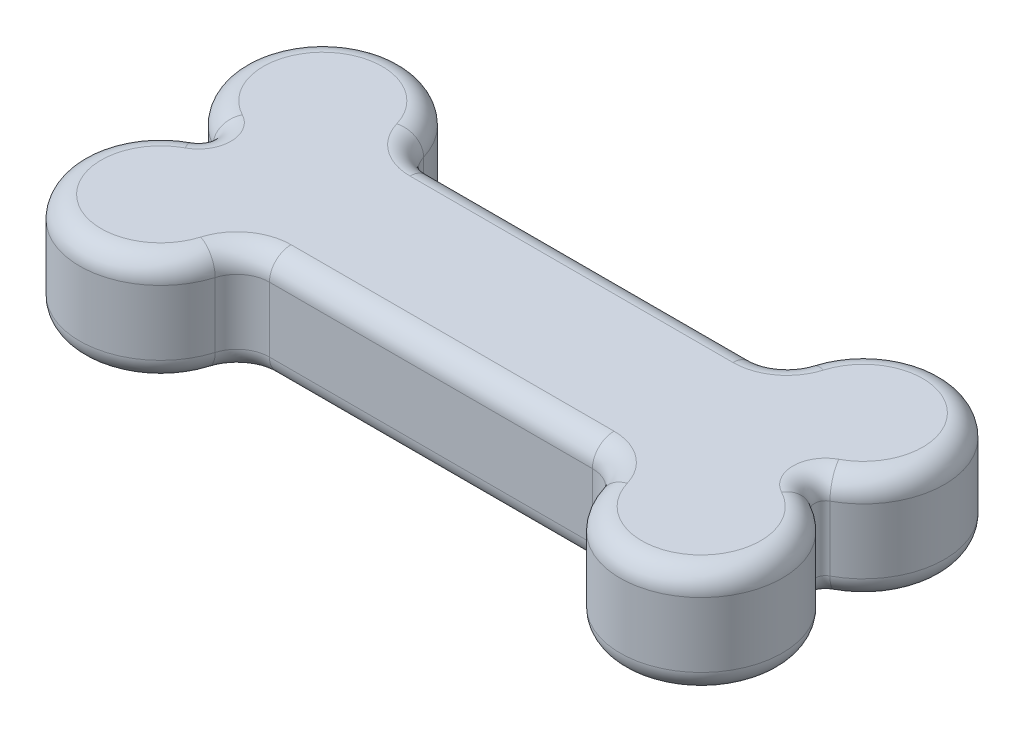
ISO-10303-21;
HEADER;
FILE_DESCRIPTION(('STEP AP214'),'2;1');
FILE_NAME('part.step','',(''),(''),'','','');
FILE_SCHEMA(('AUTOMOTIVE_DESIGN { 1 0 10303 214 1 1 1 1 }'));
ENDSEC;
DATA;
#1=APPLICATION_CONTEXT('core data for automotive mechanical design processes');
#2=APPLICATION_PROTOCOL_DEFINITION('international standard','automotive_design',2000,#1);
#3=PRODUCT_CONTEXT('',#1,'mechanical');
#4=PRODUCT('Part','Part','',(#3));
#5=PRODUCT_RELATED_PRODUCT_CATEGORY('part','',(#4));
#6=PRODUCT_DEFINITION_FORMATION('','',#4);
#7=PRODUCT_DEFINITION_CONTEXT('part definition',#1,'design');
#8=PRODUCT_DEFINITION('design','',#6,#7);
#9=PRODUCT_DEFINITION_SHAPE('','',#8);
#10=(LENGTH_UNIT() NAMED_UNIT(*) SI_UNIT(.MILLI.,.METRE.));
#11=(NAMED_UNIT(*) PLANE_ANGLE_UNIT() SI_UNIT($,.RADIAN.));
#12=(NAMED_UNIT(*) SI_UNIT($,.STERADIAN.) SOLID_ANGLE_UNIT());
#13=UNCERTAINTY_MEASURE_WITH_UNIT(LENGTH_MEASURE(1.E-05),#10,'distance_accuracy_value','');
#14=(GEOMETRIC_REPRESENTATION_CONTEXT(3) GLOBAL_UNCERTAINTY_ASSIGNED_CONTEXT((#13)) GLOBAL_UNIT_ASSIGNED_CONTEXT((#10,
#11,#12)) REPRESENTATION_CONTEXT('',''));
#15=CARTESIAN_POINT('',(0.,0.,0.));
#16=DIRECTION('',(0.,0.,1.));
#17=DIRECTION('',(1.,0.,0.));
#18=AXIS2_PLACEMENT_3D('',#15,#16,#17);
#19=CARTESIAN_POINT('',(25.,10.,7.5));
#20=DIRECTION('',(0.,-1.,0.));
#21=DIRECTION('',(0.,0.,-1.));
#22=AXIS2_PLACEMENT_3D('',#19,#20,#21);
#23=CYLINDRICAL_SURFACE('',#22,7.5);
#24=DIRECTION('',(0.,-1.,0.));
#25=VECTOR('',#24,1.);
#26=CARTESIAN_POINT('',(17.8126386437507,10.,9.64285714285714));
#27=LINE('',#26,#25);
#28=CARTESIAN_POINT('',(17.8126386437507,8.,9.64285714285714));
#29=VERTEX_POINT('',#28);
#30=CARTESIAN_POINT('',(17.8126386437507,2.,9.64285714285714));
#31=VERTEX_POINT('',#30);
#32=EDGE_CURVE('E382',#29,#31,#27,.T.);
#33=ORIENTED_EDGE('',*,*,#32,.T.);
#34=CARTESIAN_POINT('',(25.,2.,7.5));
#35=DIRECTION('',(0.,1.,0.));
#36=DIRECTION('',(0.,0.,1.));
#37=AXIS2_PLACEMENT_3D('',#34,#35,#36);
#38=CIRCLE('',#37,7.5);
#39=CARTESIAN_POINT('',(28.5294117647059,2.,0.882352941176471));
#40=VERTEX_POINT('',#39);
#41=EDGE_CURVE('E273',#31,#40,#38,.T.);
#42=ORIENTED_EDGE('',*,*,#41,.T.);
#43=DIRECTION('',(0.,-1.,0.));
#44=VECTOR('',#43,1.);
#45=CARTESIAN_POINT('',(28.5294117647059,10.,0.882352941176471));
#46=LINE('',#45,#44);
#47=CARTESIAN_POINT('',(28.5294117647059,8.,0.882352941176471));
#48=VERTEX_POINT('',#47);
#49=EDGE_CURVE('E216',#40,#48,#46,.F.);
#50=ORIENTED_EDGE('',*,*,#49,.T.);
#51=CARTESIAN_POINT('',(25.,8.,7.5));
#52=DIRECTION('',(0.,1.,0.));
#53=DIRECTION('',(0.,0.,1.));
#54=AXIS2_PLACEMENT_3D('',#51,#52,#53);
#55=CIRCLE('',#54,7.5);
#56=EDGE_CURVE('E271',#48,#29,#55,.F.);
#57=ORIENTED_EDGE('',*,*,#56,.T.);
#58=EDGE_LOOP('',(#33,#42,#50,#57));
#59=FACE_BOUND('',#58,.T.);
#60=ADVANCED_FACE('F35',(#59),#23,.T.);
#61=CARTESIAN_POINT('',(25.,10.,-7.5));
#62=DIRECTION('',(0.,-1.,0.));
#63=DIRECTION('',(0.,0.,-1.));
#64=AXIS2_PLACEMENT_3D('',#61,#62,#63);
#65=CYLINDRICAL_SURFACE('',#64,7.5);
#66=DIRECTION('',(0.,-1.,0.));
#67=VECTOR('',#66,1.);
#68=CARTESIAN_POINT('',(28.5294117647059,10.,-0.882352941176469));
#69=LINE('',#68,#67);
#70=CARTESIAN_POINT('',(28.5294117647059,8.,-0.882352941176469));
#71=VERTEX_POINT('',#70);
#72=CARTESIAN_POINT('',(28.5294117647059,2.,-0.882352941176469));
#73=VERTEX_POINT('',#72);
#74=EDGE_CURVE('E406',#71,#73,#69,.T.);
#75=ORIENTED_EDGE('',*,*,#74,.T.);
#76=CARTESIAN_POINT('',(25.,2.,-7.5));
#77=DIRECTION('',(0.,1.,0.));
#78=DIRECTION('',(0.,0.,1.));
#79=AXIS2_PLACEMENT_3D('',#76,#77,#78);
#80=CIRCLE('',#79,7.5);
#81=CARTESIAN_POINT('',(17.8126386437507,2.,-9.64285714285714));
#82=VERTEX_POINT('',#81);
#83=EDGE_CURVE('E232',#73,#82,#80,.T.);
#84=ORIENTED_EDGE('',*,*,#83,.T.);
#85=DIRECTION('',(0.,-1.,0.));
#86=VECTOR('',#85,1.);
#87=CARTESIAN_POINT('',(17.8126386437507,10.,-9.64285714285714));
#88=LINE('',#87,#86);
#89=CARTESIAN_POINT('',(17.8126386437507,8.,-9.64285714285714));
#90=VERTEX_POINT('',#89);
#91=EDGE_CURVE('E373',#82,#90,#88,.F.);
#92=ORIENTED_EDGE('',*,*,#91,.T.);
#93=CARTESIAN_POINT('',(25.,8.,-7.5));
#94=DIRECTION('',(0.,1.,0.));
#95=DIRECTION('',(0.,0.,1.));
#96=AXIS2_PLACEMENT_3D('',#93,#94,#95);
#97=CIRCLE('',#96,7.5);
#98=EDGE_CURVE('E230',#90,#71,#97,.F.);
#99=ORIENTED_EDGE('',*,*,#98,.T.);
#100=EDGE_LOOP('',(#75,#84,#92,#99));
#101=FACE_BOUND('',#100,.T.);
#102=ADVANCED_FACE('F379',(#101),#65,.T.);
#103=CARTESIAN_POINT('',(-17.5,10.,-7.5));
#104=DIRECTION('',(0.,0.,1.));
#105=DIRECTION('',(1.,0.,0.));
#106=AXIS2_PLACEMENT_3D('',#103,#104,#105);
#107=PLANE('',#106);
#108=DIRECTION('',(0.,1.,0.));
#109=VECTOR('',#108,1.);
#110=CARTESIAN_POINT('',(14.937694101251,0.,-7.5));
#111=LINE('',#110,#109);
#112=CARTESIAN_POINT('',(14.937694101251,8.,-7.5));
#113=VERTEX_POINT('',#112);
#114=CARTESIAN_POINT('',(14.937694101251,2.,-7.5));
#115=VERTEX_POINT('',#114);
#116=EDGE_CURVE('E376',#113,#115,#111,.F.);
#117=ORIENTED_EDGE('',*,*,#116,.T.);
#118=DIRECTION('',(-1.,0.,0.));
#119=VECTOR('',#118,1.);
#120=CARTESIAN_POINT('',(-17.5,2.,-7.5));
#121=LINE('',#120,#119);
#122=CARTESIAN_POINT('',(-14.9376941012509,2.,-7.5));
#123=VERTEX_POINT('',#122);
#124=EDGE_CURVE('E240',#115,#123,#121,.T.);
#125=ORIENTED_EDGE('',*,*,#124,.T.);
#126=DIRECTION('',(0.,1.,0.));
#127=VECTOR('',#126,1.);
#128=CARTESIAN_POINT('',(-14.9376941012509,10.,-7.5));
#129=LINE('',#128,#127);
#130=CARTESIAN_POINT('',(-14.9376941012509,8.,-7.5));
#131=VERTEX_POINT('',#130);
#132=EDGE_CURVE('E383',#123,#131,#129,.T.);
#133=ORIENTED_EDGE('',*,*,#132,.T.);
#134=DIRECTION('',(-1.,0.,0.));
#135=VECTOR('',#134,1.);
#136=CARTESIAN_POINT('',(14.937694101251,8.,-7.5));
#137=LINE('',#136,#135);
#138=EDGE_CURVE('E238',#131,#113,#137,.F.);
#139=ORIENTED_EDGE('',*,*,#138,.T.);
#140=EDGE_LOOP('',(#117,#125,#133,#139));
#141=FACE_BOUND('',#140,.T.);
#142=ADVANCED_FACE('F499',(#141),#107,.F.);
#143=CARTESIAN_POINT('',(-25.,10.,-7.5));
#144=DIRECTION('',(0.,-1.,0.));
#145=DIRECTION('',(0.,0.,-1.));
#146=AXIS2_PLACEMENT_3D('',#143,#144,#145);
#147=CYLINDRICAL_SURFACE('',#146,7.5);
#148=DIRECTION('',(0.,-1.,0.));
#149=VECTOR('',#148,1.);
#150=CARTESIAN_POINT('',(-17.8126386437507,10.,-9.64285714285714));
#151=LINE('',#150,#149);
#152=CARTESIAN_POINT('',(-17.8126386437507,8.,-9.64285714285714));
#153=VERTEX_POINT('',#152);
#154=CARTESIAN_POINT('',(-17.8126386437507,2.,-9.64285714285714));
#155=VERTEX_POINT('',#154);
#156=EDGE_CURVE('E324',#153,#155,#151,.T.);
#157=ORIENTED_EDGE('',*,*,#156,.T.);
#158=CARTESIAN_POINT('',(-25.,2.,-7.5));
#159=DIRECTION('',(0.,1.,0.));
#160=DIRECTION('',(0.,0.,1.));
#161=AXIS2_PLACEMENT_3D('',#158,#159,#160);
#162=CIRCLE('',#161,7.5);
#163=CARTESIAN_POINT('',(-28.5294117647059,2.,-0.882352941176471));
#164=VERTEX_POINT('',#163);
#165=EDGE_CURVE('E248',#155,#164,#162,.T.);
#166=ORIENTED_EDGE('',*,*,#165,.T.);
#167=DIRECTION('',(0.,-1.,0.));
#168=VECTOR('',#167,1.);
#169=CARTESIAN_POINT('',(-28.5294117647059,10.,-0.882352941176471));
#170=LINE('',#169,#168);
#171=CARTESIAN_POINT('',(-28.5294117647059,8.,-0.882352941176471));
#172=VERTEX_POINT('',#171);
#173=EDGE_CURVE('E403',#164,#172,#170,.F.);
#174=ORIENTED_EDGE('',*,*,#173,.T.);
#175=CARTESIAN_POINT('',(-25.,8.,-7.5));
#176=DIRECTION('',(0.,1.,0.));
#177=DIRECTION('',(0.,0.,1.));
#178=AXIS2_PLACEMENT_3D('',#175,#176,#177);
#179=CIRCLE('',#178,7.5);
#180=EDGE_CURVE('E246',#172,#153,#179,.F.);
#181=ORIENTED_EDGE('',*,*,#180,.T.);
#182=EDGE_LOOP('',(#157,#166,#174,#181));
#183=FACE_BOUND('',#182,.T.);
#184=ADVANCED_FACE('F805',(#183),#147,.T.);
#185=CARTESIAN_POINT('',(-25.,10.,7.5));
#186=DIRECTION('',(0.,-1.,0.));
#187=DIRECTION('',(0.,0.,-1.));
#188=AXIS2_PLACEMENT_3D('',#185,#186,#187);
#189=CYLINDRICAL_SURFACE('',#188,7.5);
#190=DIRECTION('',(0.,-1.,0.));
#191=VECTOR('',#190,1.);
#192=CARTESIAN_POINT('',(-28.5294117647059,10.,0.88235294117647));
#193=LINE('',#192,#191);
#194=CARTESIAN_POINT('',(-28.5294117647059,8.,0.88235294117647));
#195=VERTEX_POINT('',#194);
#196=CARTESIAN_POINT('',(-28.5294117647059,2.,0.88235294117647));
#197=VERTEX_POINT('',#196);
#198=EDGE_CURVE('E400',#195,#197,#193,.T.);
#199=ORIENTED_EDGE('',*,*,#198,.T.);
#200=CARTESIAN_POINT('',(-25.,2.,7.5));
#201=DIRECTION('',(0.,1.,0.));
#202=DIRECTION('',(0.,0.,1.));
#203=AXIS2_PLACEMENT_3D('',#200,#201,#202);
#204=CIRCLE('',#203,7.5);
#205=CARTESIAN_POINT('',(-17.8126386437507,2.,9.64285714285714));
#206=VERTEX_POINT('',#205);
#207=EDGE_CURVE('E256',#197,#206,#204,.T.);
#208=ORIENTED_EDGE('',*,*,#207,.T.);
#209=DIRECTION('',(0.,-1.,0.));
#210=VECTOR('',#209,1.);
#211=CARTESIAN_POINT('',(-17.8126386437507,10.,9.64285714285714));
#212=LINE('',#211,#210);
#213=CARTESIAN_POINT('',(-17.8126386437507,8.,9.64285714285714));
#214=VERTEX_POINT('',#213);
#215=EDGE_CURVE('E397',#206,#214,#212,.F.);
#216=ORIENTED_EDGE('',*,*,#215,.T.);
#217=CARTESIAN_POINT('',(-25.,8.,7.5));
#218=DIRECTION('',(0.,1.,0.));
#219=DIRECTION('',(0.,0.,1.));
#220=AXIS2_PLACEMENT_3D('',#217,#218,#219);
#221=CIRCLE('',#220,7.5);
#222=EDGE_CURVE('E254',#214,#195,#221,.F.);
#223=ORIENTED_EDGE('',*,*,#222,.T.);
#224=EDGE_LOOP('',(#199,#208,#216,#223));
#225=FACE_BOUND('',#224,.T.);
#226=ADVANCED_FACE('F797',(#225),#189,.T.);
#227=CARTESIAN_POINT('',(-17.5,10.,7.5));
#228=DIRECTION('',(0.,0.,-1.));
#229=DIRECTION('',(-1.,0.,0.));
#230=AXIS2_PLACEMENT_3D('',#227,#228,#229);
#231=PLANE('',#230);
#232=DIRECTION('',(0.,1.,0.));
#233=VECTOR('',#232,1.);
#234=CARTESIAN_POINT('',(-14.9376941012509,0.,7.5));
#235=LINE('',#234,#233);
#236=CARTESIAN_POINT('',(-14.9376941012509,8.,7.5));
#237=VERTEX_POINT('',#236);
#238=CARTESIAN_POINT('',(-14.9376941012509,2.,7.5));
#239=VERTEX_POINT('',#238);
#240=EDGE_CURVE('E386',#237,#239,#235,.F.);
#241=ORIENTED_EDGE('',*,*,#240,.T.);
#242=DIRECTION('',(1.,0.,0.));
#243=VECTOR('',#242,1.);
#244=CARTESIAN_POINT('',(-17.5,2.,7.5));
#245=LINE('',#244,#243);
#246=CARTESIAN_POINT('',(14.937694101251,2.,7.5));
#247=VERTEX_POINT('',#246);
#248=EDGE_CURVE('E265',#239,#247,#245,.T.);
#249=ORIENTED_EDGE('',*,*,#248,.T.);
#250=DIRECTION('',(0.,1.,0.));
#251=VECTOR('',#250,1.);
#252=CARTESIAN_POINT('',(14.937694101251,10.,7.5));
#253=LINE('',#252,#251);
#254=CARTESIAN_POINT('',(14.937694101251,8.,7.5));
#255=VERTEX_POINT('',#254);
#256=EDGE_CURVE('E394',#247,#255,#253,.T.);
#257=ORIENTED_EDGE('',*,*,#256,.T.);
#258=DIRECTION('',(1.,0.,0.));
#259=VECTOR('',#258,1.);
#260=CARTESIAN_POINT('',(-14.9376941012509,8.,7.5));
#261=LINE('',#260,#259);
#262=EDGE_CURVE('E263',#255,#237,#261,.F.);
#263=ORIENTED_EDGE('',*,*,#262,.T.);
#264=EDGE_LOOP('',(#241,#249,#257,#263));
#265=FACE_BOUND('',#264,.T.);
#266=ADVANCED_FACE('F459',(#265),#231,.F.);
#267=CARTESIAN_POINT('',(25.,10.,7.5));
#268=DIRECTION('',(0.,1.,0.));
#269=DIRECTION('',(0.,0.,1.));
#270=AXIS2_PLACEMENT_3D('',#267,#268,#269);
#271=PLANE('',#270);
#272=CARTESIAN_POINT('',(-25.,10.,7.5));
#273=DIRECTION('',(0.,1.,0.));
#274=DIRECTION('',(0.,0.,1.));
#275=AXIS2_PLACEMENT_3D('',#272,#273,#274);
#276=CIRCLE('',#275,5.5);
#277=CARTESIAN_POINT('',(-27.5882352941176,10.,2.64705882352941));
#278=VERTEX_POINT('',#277);
#279=CARTESIAN_POINT('',(-19.7292683387505,10.,9.07142857142857));
#280=VERTEX_POINT('',#279);
#281=EDGE_CURVE('E44',#278,#280,#276,.T.);
#282=ORIENTED_EDGE('',*,*,#281,.T.);
#283=CARTESIAN_POINT('',(-14.9376941012509,10.,10.5));
#284=DIRECTION('',(0.,1.,0.));
#285=DIRECTION('',(0.,0.,1.));
#286=AXIS2_PLACEMENT_3D('',#283,#284,#285);
#287=CIRCLE('',#286,5.);
#288=CARTESIAN_POINT('',(-14.9376941012509,10.,5.5));
#289=VERTEX_POINT('',#288);
#290=EDGE_CURVE('E11',#280,#289,#287,.F.);
#291=ORIENTED_EDGE('',*,*,#290,.T.);
#292=DIRECTION('',(1.,0.,0.));
#293=VECTOR('',#292,1.);
#294=CARTESIAN_POINT('',(14.937694101251,10.,5.5));
#295=LINE('',#294,#293);
#296=CARTESIAN_POINT('',(14.937694101251,10.,5.5));
#297=VERTEX_POINT('',#296);
#298=EDGE_CURVE('E275',#289,#297,#295,.T.);
#299=ORIENTED_EDGE('',*,*,#298,.T.);
#300=CARTESIAN_POINT('',(14.937694101251,10.,10.5));
#301=DIRECTION('',(0.,1.,0.));
#302=DIRECTION('',(0.,0.,1.));
#303=AXIS2_PLACEMENT_3D('',#300,#301,#302);
#304=CIRCLE('',#303,5.);
#305=CARTESIAN_POINT('',(19.7292683387505,10.,9.07142857142857));
#306=VERTEX_POINT('',#305);
#307=EDGE_CURVE('E277',#297,#306,#304,.F.);
#308=ORIENTED_EDGE('',*,*,#307,.T.);
#309=CARTESIAN_POINT('',(25.,10.,7.5));
#310=DIRECTION('',(0.,1.,0.));
#311=DIRECTION('',(0.,0.,1.));
#312=AXIS2_PLACEMENT_3D('',#309,#310,#311);
#313=CIRCLE('',#312,5.5);
#314=CARTESIAN_POINT('',(27.5882352941176,10.,2.64705882352941));
#315=VERTEX_POINT('',#314);
#316=EDGE_CURVE('E279',#306,#315,#313,.T.);
#317=ORIENTED_EDGE('',*,*,#316,.T.);
#318=CARTESIAN_POINT('',(29.,10.,0.));
#319=DIRECTION('',(0.,1.,0.));
#320=DIRECTION('',(0.,0.,1.));
#321=AXIS2_PLACEMENT_3D('',#318,#319,#320);
#322=CIRCLE('',#321,3.);
#323=CARTESIAN_POINT('',(27.5882352941177,10.,-2.64705882352941));
#324=VERTEX_POINT('',#323);
#325=EDGE_CURVE('E281',#315,#324,#322,.F.);
#326=ORIENTED_EDGE('',*,*,#325,.T.);
#327=CARTESIAN_POINT('',(25.,10.,-7.5));
#328=DIRECTION('',(0.,1.,0.));
#329=DIRECTION('',(0.,0.,1.));
#330=AXIS2_PLACEMENT_3D('',#327,#328,#329);
#331=CIRCLE('',#330,5.5);
#332=CARTESIAN_POINT('',(19.7292683387505,10.,-9.07142857142857));
#333=VERTEX_POINT('',#332);
#334=EDGE_CURVE('E283',#324,#333,#331,.T.);
#335=ORIENTED_EDGE('',*,*,#334,.T.);
#336=CARTESIAN_POINT('',(14.937694101251,10.,-10.5));
#337=DIRECTION('',(0.,1.,0.));
#338=DIRECTION('',(0.,0.,1.));
#339=AXIS2_PLACEMENT_3D('',#336,#337,#338);
#340=CIRCLE('',#339,5.);
#341=CARTESIAN_POINT('',(14.937694101251,10.,-5.5));
#342=VERTEX_POINT('',#341);
#343=EDGE_CURVE('E285',#333,#342,#340,.F.);
#344=ORIENTED_EDGE('',*,*,#343,.T.);
#345=DIRECTION('',(-1.,0.,0.));
#346=VECTOR('',#345,1.);
#347=CARTESIAN_POINT('',(-14.9376941012509,10.,-5.5));
#348=LINE('',#347,#346);
#349=CARTESIAN_POINT('',(-14.9376941012509,10.,-5.5));
#350=VERTEX_POINT('',#349);
#351=EDGE_CURVE('E287',#342,#350,#348,.T.);
#352=ORIENTED_EDGE('',*,*,#351,.T.);
#353=CARTESIAN_POINT('',(-14.9376941012509,10.,-10.5));
#354=DIRECTION('',(0.,1.,0.));
#355=DIRECTION('',(0.,0.,1.));
#356=AXIS2_PLACEMENT_3D('',#353,#354,#355);
#357=CIRCLE('',#356,5.);
#358=CARTESIAN_POINT('',(-19.7292683387505,10.,-9.07142857142857));
#359=VERTEX_POINT('',#358);
#360=EDGE_CURVE('E289',#350,#359,#357,.F.);
#361=ORIENTED_EDGE('',*,*,#360,.T.);
#362=CARTESIAN_POINT('',(-25.,10.,-7.5));
#363=DIRECTION('',(0.,1.,0.));
#364=DIRECTION('',(0.,0.,1.));
#365=AXIS2_PLACEMENT_3D('',#362,#363,#364);
#366=CIRCLE('',#365,5.5);
#367=CARTESIAN_POINT('',(-27.5882352941176,10.,-2.64705882352941));
#368=VERTEX_POINT('',#367);
#369=EDGE_CURVE('E291',#359,#368,#366,.T.);
#370=ORIENTED_EDGE('',*,*,#369,.T.);
#371=CARTESIAN_POINT('',(-29.,10.,0.));
#372=DIRECTION('',(0.,1.,0.));
#373=DIRECTION('',(0.,0.,1.));
#374=AXIS2_PLACEMENT_3D('',#371,#372,#373);
#375=CIRCLE('',#374,3.);
#376=EDGE_CURVE('E55',#368,#278,#375,.F.);
#377=ORIENTED_EDGE('',*,*,#376,.T.);
#378=EDGE_LOOP('',(#282,#291,#299,#308,#317,#326,#335,#344,#352,#361,#370,#377));
#379=FACE_BOUND('',#378,.T.);
#380=ADVANCED_FACE('F514',(#379),#271,.T.);
#381=CARTESIAN_POINT('',(25.,0.,7.5));
#382=DIRECTION('',(0.,1.,0.));
#383=DIRECTION('',(0.,0.,1.));
#384=AXIS2_PLACEMENT_3D('',#381,#382,#383);
#385=PLANE('',#384);
#386=CARTESIAN_POINT('',(25.,0.,-7.5));
#387=DIRECTION('',(0.,1.,0.));
#388=DIRECTION('',(0.,0.,1.));
#389=AXIS2_PLACEMENT_3D('',#386,#387,#388);
#390=CIRCLE('',#389,5.5);
#391=CARTESIAN_POINT('',(19.7292683387505,0.,-9.07142857142857));
#392=VERTEX_POINT('',#391);
#393=CARTESIAN_POINT('',(27.5882352941176,0.,-2.64705882352941));
#394=VERTEX_POINT('',#393);
#395=EDGE_CURVE('E220',#392,#394,#390,.F.);
#396=ORIENTED_EDGE('',*,*,#395,.T.);
#397=CARTESIAN_POINT('',(29.,0.,0.));
#398=DIRECTION('',(0.,1.,0.));
#399=DIRECTION('',(0.,0.,1.));
#400=AXIS2_PLACEMENT_3D('',#397,#398,#399);
#401=CIRCLE('',#400,3.);
#402=CARTESIAN_POINT('',(27.5882352941176,0.,2.64705882352941));
#403=VERTEX_POINT('',#402);
#404=EDGE_CURVE('E201',#394,#403,#401,.T.);
#405=ORIENTED_EDGE('',*,*,#404,.T.);
#406=CARTESIAN_POINT('',(25.,0.,7.5));
#407=DIRECTION('',(0.,1.,0.));
#408=DIRECTION('',(0.,0.,1.));
#409=AXIS2_PLACEMENT_3D('',#406,#407,#408);
#410=CIRCLE('',#409,5.5);
#411=CARTESIAN_POINT('',(19.7292683387505,0.,9.07142857142857));
#412=VERTEX_POINT('',#411);
#413=EDGE_CURVE('E209',#403,#412,#410,.F.);
#414=ORIENTED_EDGE('',*,*,#413,.T.);
#415=CARTESIAN_POINT('',(14.937694101251,0.,10.5));
#416=DIRECTION('',(0.,1.,0.));
#417=DIRECTION('',(0.,0.,1.));
#418=AXIS2_PLACEMENT_3D('',#415,#416,#417);
#419=CIRCLE('',#418,5.);
#420=CARTESIAN_POINT('',(14.937694101251,0.,5.5));
#421=VERTEX_POINT('',#420);
#422=EDGE_CURVE('E215',#412,#421,#419,.T.);
#423=ORIENTED_EDGE('',*,*,#422,.T.);
#424=DIRECTION('',(1.,0.,0.));
#425=VECTOR('',#424,1.);
#426=CARTESIAN_POINT('',(25.,0.,5.5));
#427=LINE('',#426,#425);
#428=CARTESIAN_POINT('',(-14.9376941012509,0.,5.5));
#429=VERTEX_POINT('',#428);
#430=EDGE_CURVE('E411',#421,#429,#427,.F.);
#431=ORIENTED_EDGE('',*,*,#430,.T.);
#432=CARTESIAN_POINT('',(-14.9376941012509,0.,10.5));
#433=DIRECTION('',(0.,1.,0.));
#434=DIRECTION('',(0.,0.,1.));
#435=AXIS2_PLACEMENT_3D('',#432,#433,#434);
#436=CIRCLE('',#435,5.);
#437=CARTESIAN_POINT('',(-19.7292683387505,0.,9.07142857142857));
#438=VERTEX_POINT('',#437);
#439=EDGE_CURVE('E413',#429,#438,#436,.T.);
#440=ORIENTED_EDGE('',*,*,#439,.T.);
#441=CARTESIAN_POINT('',(-25.,0.,7.5));
#442=DIRECTION('',(0.,1.,0.));
#443=DIRECTION('',(0.,0.,1.));
#444=AXIS2_PLACEMENT_3D('',#441,#442,#443);
#445=CIRCLE('',#444,5.5);
#446=CARTESIAN_POINT('',(-27.5882352941176,0.,2.64705882352942));
#447=VERTEX_POINT('',#446);
#448=EDGE_CURVE('E415',#438,#447,#445,.F.);
#449=ORIENTED_EDGE('',*,*,#448,.T.);
#450=CARTESIAN_POINT('',(-29.,0.,0.));
#451=DIRECTION('',(0.,1.,0.));
#452=DIRECTION('',(0.,0.,1.));
#453=AXIS2_PLACEMENT_3D('',#450,#451,#452);
#454=CIRCLE('',#453,3.);
#455=CARTESIAN_POINT('',(-27.5882352941176,0.,-2.64705882352941));
#456=VERTEX_POINT('',#455);
#457=EDGE_CURVE('E417',#447,#456,#454,.T.);
#458=ORIENTED_EDGE('',*,*,#457,.T.);
#459=CARTESIAN_POINT('',(-25.,0.,-7.5));
#460=DIRECTION('',(0.,1.,0.));
#461=DIRECTION('',(0.,0.,1.));
#462=AXIS2_PLACEMENT_3D('',#459,#460,#461);
#463=CIRCLE('',#462,5.5);
#464=CARTESIAN_POINT('',(-19.7292683387505,0.,-9.07142857142857));
#465=VERTEX_POINT('',#464);
#466=EDGE_CURVE('E419',#456,#465,#463,.F.);
#467=ORIENTED_EDGE('',*,*,#466,.T.);
#468=CARTESIAN_POINT('',(-14.9376941012509,0.,-10.5));
#469=DIRECTION('',(0.,1.,0.));
#470=DIRECTION('',(0.,0.,1.));
#471=AXIS2_PLACEMENT_3D('',#468,#469,#470);
#472=CIRCLE('',#471,5.);
#473=CARTESIAN_POINT('',(-14.9376941012509,0.,-5.5));
#474=VERTEX_POINT('',#473);
#475=EDGE_CURVE('E421',#465,#474,#472,.T.);
#476=ORIENTED_EDGE('',*,*,#475,.T.);
#477=DIRECTION('',(-1.,0.,0.));
#478=VECTOR('',#477,1.);
#479=CARTESIAN_POINT('',(25.,0.,-5.5));
#480=LINE('',#479,#478);
#481=CARTESIAN_POINT('',(14.937694101251,0.,-5.5));
#482=VERTEX_POINT('',#481);
#483=EDGE_CURVE('E423',#474,#482,#480,.F.);
#484=ORIENTED_EDGE('',*,*,#483,.T.);
#485=CARTESIAN_POINT('',(14.937694101251,0.,-10.5));
#486=DIRECTION('',(0.,1.,0.));
#487=DIRECTION('',(0.,0.,1.));
#488=AXIS2_PLACEMENT_3D('',#485,#486,#487);
#489=CIRCLE('',#488,5.);
#490=EDGE_CURVE('E225',#482,#392,#489,.T.);
#491=ORIENTED_EDGE('',*,*,#490,.T.);
#492=EDGE_LOOP('',(#396,#405,#414,#423,#431,#440,#449,#458,#467,#476,#484,#491));
#493=FACE_BOUND('',#492,.T.);
#494=ADVANCED_FACE('F218',(#493),#385,.F.);
#495=CARTESIAN_POINT('',(-14.9376941012509,10.,-10.5));
#496=DIRECTION('',(0.,-1.,0.));
#497=DIRECTION('',(0.,0.,-1.));
#498=AXIS2_PLACEMENT_3D('',#495,#496,#497);
#499=CYLINDRICAL_SURFACE('',#498,3.);
#500=ORIENTED_EDGE('',*,*,#132,.F.);
#501=CARTESIAN_POINT('',(-14.9376941012509,2.,-10.5));
#502=DIRECTION('',(0.,1.,0.));
#503=DIRECTION('',(0.,0.,1.));
#504=AXIS2_PLACEMENT_3D('',#501,#502,#503);
#505=CIRCLE('',#504,3.);
#506=EDGE_CURVE('E244',#123,#155,#505,.F.);
#507=ORIENTED_EDGE('',*,*,#506,.T.);
#508=ORIENTED_EDGE('',*,*,#156,.F.);
#509=CARTESIAN_POINT('',(-14.9376941012509,8.,-10.5));
#510=DIRECTION('',(0.,1.,0.));
#511=DIRECTION('',(0.,0.,1.));
#512=AXIS2_PLACEMENT_3D('',#509,#510,#511);
#513=CIRCLE('',#512,3.);
#514=EDGE_CURVE('E242',#153,#131,#513,.T.);
#515=ORIENTED_EDGE('',*,*,#514,.T.);
#516=EDGE_LOOP('',(#500,#507,#508,#515));
#517=FACE_BOUND('',#516,.T.);
#518=ADVANCED_FACE('F501',(#517),#499,.F.);
#519=CARTESIAN_POINT('',(14.937694101251,10.,-10.5));
#520=DIRECTION('',(0.,-1.,0.));
#521=DIRECTION('',(0.,0.,-1.));
#522=AXIS2_PLACEMENT_3D('',#519,#520,#521);
#523=CYLINDRICAL_SURFACE('',#522,3.);
#524=ORIENTED_EDGE('',*,*,#91,.F.);
#525=CARTESIAN_POINT('',(14.937694101251,2.,-10.5));
#526=DIRECTION('',(0.,1.,0.));
#527=DIRECTION('',(0.,0.,1.));
#528=AXIS2_PLACEMENT_3D('',#525,#526,#527);
#529=CIRCLE('',#528,3.);
#530=EDGE_CURVE('E236',#82,#115,#529,.F.);
#531=ORIENTED_EDGE('',*,*,#530,.T.);
#532=ORIENTED_EDGE('',*,*,#116,.F.);
#533=CARTESIAN_POINT('',(14.937694101251,8.,-10.5));
#534=DIRECTION('',(0.,1.,0.));
#535=DIRECTION('',(0.,0.,1.));
#536=AXIS2_PLACEMENT_3D('',#533,#534,#535);
#537=CIRCLE('',#536,3.);
#538=EDGE_CURVE('E234',#113,#90,#537,.T.);
#539=ORIENTED_EDGE('',*,*,#538,.T.);
#540=EDGE_LOOP('',(#524,#531,#532,#539));
#541=FACE_BOUND('',#540,.T.);
#542=ADVANCED_FACE('F372',(#541),#523,.F.);
#543=CARTESIAN_POINT('',(14.937694101251,10.,10.5));
#544=DIRECTION('',(0.,-1.,0.));
#545=DIRECTION('',(0.,0.,-1.));
#546=AXIS2_PLACEMENT_3D('',#543,#544,#545);
#547=CYLINDRICAL_SURFACE('',#546,3.);
#548=ORIENTED_EDGE('',*,*,#256,.F.);
#549=CARTESIAN_POINT('',(14.937694101251,2.,10.5));
#550=DIRECTION('',(0.,1.,0.));
#551=DIRECTION('',(0.,0.,1.));
#552=AXIS2_PLACEMENT_3D('',#549,#550,#551);
#553=CIRCLE('',#552,3.);
#554=EDGE_CURVE('E269',#247,#31,#553,.F.);
#555=ORIENTED_EDGE('',*,*,#554,.T.);
#556=ORIENTED_EDGE('',*,*,#32,.F.);
#557=CARTESIAN_POINT('',(14.937694101251,8.,10.5));
#558=DIRECTION('',(0.,1.,0.));
#559=DIRECTION('',(0.,0.,1.));
#560=AXIS2_PLACEMENT_3D('',#557,#558,#559);
#561=CIRCLE('',#560,3.);
#562=EDGE_CURVE('E267',#29,#255,#561,.T.);
#563=ORIENTED_EDGE('',*,*,#562,.T.);
#564=EDGE_LOOP('',(#548,#555,#556,#563));
#565=FACE_BOUND('',#564,.T.);
#566=ADVANCED_FACE('F456',(#565),#547,.F.);
#567=CARTESIAN_POINT('',(-14.9376941012509,10.,10.5));
#568=DIRECTION('',(0.,-1.,0.));
#569=DIRECTION('',(0.,0.,-1.));
#570=AXIS2_PLACEMENT_3D('',#567,#568,#569);
#571=CYLINDRICAL_SURFACE('',#570,3.);
#572=ORIENTED_EDGE('',*,*,#215,.F.);
#573=CARTESIAN_POINT('',(-14.9376941012509,2.,10.5));
#574=DIRECTION('',(0.,1.,0.));
#575=DIRECTION('',(0.,0.,1.));
#576=AXIS2_PLACEMENT_3D('',#573,#574,#575);
#577=CIRCLE('',#576,3.);
#578=EDGE_CURVE('E261',#206,#239,#577,.F.);
#579=ORIENTED_EDGE('',*,*,#578,.T.);
#580=ORIENTED_EDGE('',*,*,#240,.F.);
#581=CARTESIAN_POINT('',(-14.9376941012509,8.,10.5));
#582=DIRECTION('',(0.,1.,0.));
#583=DIRECTION('',(0.,0.,1.));
#584=AXIS2_PLACEMENT_3D('',#581,#582,#583);
#585=CIRCLE('',#584,3.);
#586=EDGE_CURVE('E258',#237,#214,#585,.T.);
#587=ORIENTED_EDGE('',*,*,#586,.T.);
#588=EDGE_LOOP('',(#572,#579,#580,#587));
#589=FACE_BOUND('',#588,.T.);
#590=ADVANCED_FACE('F537',(#589),#571,.F.);
#591=CARTESIAN_POINT('',(-29.,10.,0.));
#592=DIRECTION('',(0.,1.,0.));
#593=DIRECTION('',(0.,0.,1.));
#594=AXIS2_PLACEMENT_3D('',#591,#592,#593);
#595=CYLINDRICAL_SURFACE('',#594,1.);
#596=ORIENTED_EDGE('',*,*,#173,.F.);
#597=CARTESIAN_POINT('',(-29.,2.,0.));
#598=DIRECTION('',(0.,1.,0.));
#599=DIRECTION('',(0.,0.,1.));
#600=AXIS2_PLACEMENT_3D('',#597,#598,#599);
#601=CIRCLE('',#600,1.);
#602=EDGE_CURVE('E252',#164,#197,#601,.F.);
#603=ORIENTED_EDGE('',*,*,#602,.T.);
#604=ORIENTED_EDGE('',*,*,#198,.F.);
#605=CARTESIAN_POINT('',(-29.,8.,0.));
#606=DIRECTION('',(0.,1.,0.));
#607=DIRECTION('',(0.,0.,1.));
#608=AXIS2_PLACEMENT_3D('',#605,#606,#607);
#609=CIRCLE('',#608,1.);
#610=EDGE_CURVE('E250',#195,#172,#609,.T.);
#611=ORIENTED_EDGE('',*,*,#610,.T.);
#612=EDGE_LOOP('',(#596,#603,#604,#611));
#613=FACE_BOUND('',#612,.T.);
#614=ADVANCED_FACE('F540',(#613),#595,.F.);
#615=CARTESIAN_POINT('',(29.,10.,0.));
#616=DIRECTION('',(0.,1.,0.));
#617=DIRECTION('',(0.,0.,1.));
#618=AXIS2_PLACEMENT_3D('',#615,#616,#617);
#619=CYLINDRICAL_SURFACE('',#618,1.);
#620=ORIENTED_EDGE('',*,*,#49,.F.);
#621=CARTESIAN_POINT('',(29.,2.,0.));
#622=DIRECTION('',(0.,1.,0.));
#623=DIRECTION('',(0.,0.,1.));
#624=AXIS2_PLACEMENT_3D('',#621,#622,#623);
#625=CIRCLE('',#624,1.);
#626=EDGE_CURVE('E203',#40,#73,#625,.F.);
#627=ORIENTED_EDGE('',*,*,#626,.T.);
#628=ORIENTED_EDGE('',*,*,#74,.F.);
#629=CARTESIAN_POINT('',(29.,8.,0.));
#630=DIRECTION('',(0.,1.,0.));
#631=DIRECTION('',(0.,0.,1.));
#632=AXIS2_PLACEMENT_3D('',#629,#630,#631);
#633=CIRCLE('',#632,1.);
#634=EDGE_CURVE('E222',#71,#48,#633,.T.);
#635=ORIENTED_EDGE('',*,*,#634,.T.);
#636=EDGE_LOOP('',(#620,#627,#628,#635));
#637=FACE_BOUND('',#636,.T.);
#638=ADVANCED_FACE('F434',(#637),#619,.F.);
#639=CARTESIAN_POINT('',(-29.,2.,0.));
#640=DIRECTION('',(0.,1.,0.));
#641=DIRECTION('',(0.,0.,1.));
#642=AXIS2_PLACEMENT_3D('',#639,#640,#641);
#643=TOROIDAL_SURFACE('',#642,3.,2.);
#644=CARTESIAN_POINT('',(-27.5882352941176,2.,2.64705882352942));
#645=DIRECTION('',(-0.882352941176472,0.,0.470588235294115));
#646=DIRECTION('',(0.470588235294115,0.,0.882352941176472));
#647=AXIS2_PLACEMENT_3D('',#644,#645,#646);
#648=CIRCLE('',#647,2.);
#649=EDGE_CURVE('E318',#197,#447,#648,.T.);
#650=ORIENTED_EDGE('',*,*,#649,.F.);
#651=ORIENTED_EDGE('',*,*,#602,.F.);
#652=CARTESIAN_POINT('',(-27.5882352941176,2.,-2.64705882352941));
#653=DIRECTION('',(-0.882352941176471,0.,-0.470588235294117));
#654=DIRECTION('',(-0.470588235294117,0.,0.882352941176471));
#655=AXIS2_PLACEMENT_3D('',#652,#653,#654);
#656=CIRCLE('',#655,2.);
#657=EDGE_CURVE('E321',#456,#164,#656,.T.);
#658=ORIENTED_EDGE('',*,*,#657,.F.);
#659=ORIENTED_EDGE('',*,*,#457,.F.);
#660=EDGE_LOOP('',(#650,#651,#658,#659));
#661=FACE_BOUND('',#660,.T.);
#662=ADVANCED_FACE('F482',(#661),#643,.T.);
#663=CARTESIAN_POINT('',(-25.,2.,-7.5));
#664=DIRECTION('',(0.,1.,0.));
#665=DIRECTION('',(0.,0.,1.));
#666=AXIS2_PLACEMENT_3D('',#663,#664,#665);
#667=TOROIDAL_SURFACE('',#666,5.5,2.);
#668=ORIENTED_EDGE('',*,*,#657,.T.);
#669=ORIENTED_EDGE('',*,*,#165,.F.);
#670=CARTESIAN_POINT('',(-19.7292683387505,2.,-9.07142857142857));
#671=DIRECTION('',(0.285714285714287,0.,0.958314847499909));
#672=DIRECTION('',(0.95831484749991,0.,-0.285714285714287));
#673=AXIS2_PLACEMENT_3D('',#670,#671,#672);
#674=CIRCLE('',#673,2.);
#675=EDGE_CURVE('E315',#465,#155,#674,.T.);
#676=ORIENTED_EDGE('',*,*,#675,.F.);
#677=ORIENTED_EDGE('',*,*,#466,.F.);
#678=EDGE_LOOP('',(#668,#669,#676,#677));
#679=FACE_BOUND('',#678,.T.);
#680=ADVANCED_FACE('F488',(#679),#667,.T.);
#681=CARTESIAN_POINT('',(-25.,2.,7.5));
#682=DIRECTION('',(0.,1.,0.));
#683=DIRECTION('',(0.,0.,1.));
#684=AXIS2_PLACEMENT_3D('',#681,#682,#683);
#685=TOROIDAL_SURFACE('',#684,5.5,2.);
#686=ORIENTED_EDGE('',*,*,#649,.T.);
#687=ORIENTED_EDGE('',*,*,#448,.F.);
#688=CARTESIAN_POINT('',(-19.7292683387505,2.,9.07142857142857));
#689=DIRECTION('',(0.285714285714286,0.,-0.95831484749991));
#690=DIRECTION('',(-0.95831484749991,0.,-0.285714285714286));
#691=AXIS2_PLACEMENT_3D('',#688,#689,#690);
#692=CIRCLE('',#691,2.);
#693=EDGE_CURVE('E312',#206,#438,#692,.T.);
#694=ORIENTED_EDGE('',*,*,#693,.F.);
#695=ORIENTED_EDGE('',*,*,#207,.F.);
#696=EDGE_LOOP('',(#686,#687,#694,#695));
#697=FACE_BOUND('',#696,.T.);
#698=ADVANCED_FACE('F477',(#697),#685,.T.);
#699=CARTESIAN_POINT('',(-14.9376941012509,2.,-10.5));
#700=DIRECTION('',(0.,1.,0.));
#701=DIRECTION('',(0.,0.,1.));
#702=AXIS2_PLACEMENT_3D('',#699,#700,#701);
#703=TOROIDAL_SURFACE('',#702,5.,2.);
#704=ORIENTED_EDGE('',*,*,#675,.T.);
#705=ORIENTED_EDGE('',*,*,#506,.F.);
#706=CARTESIAN_POINT('',(-14.9376941012509,2.,-5.5));
#707=DIRECTION('',(1.,0.,0.));
#708=DIRECTION('',(0.,0.,-1.));
#709=AXIS2_PLACEMENT_3D('',#706,#707,#708);
#710=CIRCLE('',#709,2.);
#711=EDGE_CURVE('E309',#474,#123,#710,.T.);
#712=ORIENTED_EDGE('',*,*,#711,.F.);
#713=ORIENTED_EDGE('',*,*,#475,.F.);
#714=EDGE_LOOP('',(#704,#705,#712,#713));
#715=FACE_BOUND('',#714,.T.);
#716=ADVANCED_FACE('F493',(#715),#703,.T.);
#717=CARTESIAN_POINT('',(-14.9376941012509,2.,10.5));
#718=DIRECTION('',(0.,1.,0.));
#719=DIRECTION('',(0.,0.,1.));
#720=AXIS2_PLACEMENT_3D('',#717,#718,#719);
#721=TOROIDAL_SURFACE('',#720,5.,2.);
#722=ORIENTED_EDGE('',*,*,#693,.T.);
#723=ORIENTED_EDGE('',*,*,#439,.F.);
#724=CARTESIAN_POINT('',(-14.9376941012509,2.,5.5));
#725=DIRECTION('',(1.,0.,0.));
#726=DIRECTION('',(0.,0.,-1.));
#727=AXIS2_PLACEMENT_3D('',#724,#725,#726);
#728=CIRCLE('',#727,2.);
#729=EDGE_CURVE('E306',#239,#429,#728,.T.);
#730=ORIENTED_EDGE('',*,*,#729,.F.);
#731=ORIENTED_EDGE('',*,*,#578,.F.);
#732=EDGE_LOOP('',(#722,#723,#730,#731));
#733=FACE_BOUND('',#732,.T.);
#734=ADVANCED_FACE('F472',(#733),#721,.T.);
#735=CARTESIAN_POINT('',(-17.5,2.,-5.5));
#736=DIRECTION('',(-1.,0.,0.));
#737=DIRECTION('',(0.,0.,1.));
#738=AXIS2_PLACEMENT_3D('',#735,#736,#737);
#739=CYLINDRICAL_SURFACE('',#738,2.);
#740=ORIENTED_EDGE('',*,*,#711,.T.);
#741=ORIENTED_EDGE('',*,*,#124,.F.);
#742=CARTESIAN_POINT('',(14.937694101251,2.,-5.5));
#743=DIRECTION('',(1.,0.,0.));
#744=DIRECTION('',(0.,0.,-1.));
#745=AXIS2_PLACEMENT_3D('',#742,#743,#744);
#746=CIRCLE('',#745,2.);
#747=EDGE_CURVE('E303',#482,#115,#746,.T.);
#748=ORIENTED_EDGE('',*,*,#747,.F.);
#749=ORIENTED_EDGE('',*,*,#483,.F.);
#750=EDGE_LOOP('',(#740,#741,#748,#749));
#751=FACE_BOUND('',#750,.T.);
#752=ADVANCED_FACE('F496',(#751),#739,.T.);
#753=CARTESIAN_POINT('',(-17.5,2.,5.5));
#754=DIRECTION('',(1.,0.,0.));
#755=DIRECTION('',(0.,0.,-1.));
#756=AXIS2_PLACEMENT_3D('',#753,#754,#755);
#757=CYLINDRICAL_SURFACE('',#756,2.);
#758=ORIENTED_EDGE('',*,*,#729,.T.);
#759=ORIENTED_EDGE('',*,*,#430,.F.);
#760=CARTESIAN_POINT('',(14.937694101251,2.,5.5));
#761=DIRECTION('',(1.,0.,0.));
#762=DIRECTION('',(0.,0.,-1.));
#763=AXIS2_PLACEMENT_3D('',#760,#761,#762);
#764=CIRCLE('',#763,2.);
#765=EDGE_CURVE('E300',#247,#421,#764,.T.);
#766=ORIENTED_EDGE('',*,*,#765,.F.);
#767=ORIENTED_EDGE('',*,*,#248,.F.);
#768=EDGE_LOOP('',(#758,#759,#766,#767));
#769=FACE_BOUND('',#768,.T.);
#770=ADVANCED_FACE('F464',(#769),#757,.T.);
#771=CARTESIAN_POINT('',(14.937694101251,2.,-10.5));
#772=DIRECTION('',(0.,1.,0.));
#773=DIRECTION('',(0.,0.,1.));
#774=AXIS2_PLACEMENT_3D('',#771,#772,#773);
#775=TOROIDAL_SURFACE('',#774,5.,2.);
#776=ORIENTED_EDGE('',*,*,#747,.T.);
#777=ORIENTED_EDGE('',*,*,#530,.F.);
#778=CARTESIAN_POINT('',(19.7292683387505,2.,-9.07142857142857));
#779=DIRECTION('',(0.285714285714286,0.,-0.95831484749991));
#780=DIRECTION('',(-0.95831484749991,0.,-0.285714285714286));
#781=AXIS2_PLACEMENT_3D('',#778,#779,#780);
#782=CIRCLE('',#781,2.);
#783=EDGE_CURVE('E297',#392,#82,#782,.T.);
#784=ORIENTED_EDGE('',*,*,#783,.F.);
#785=ORIENTED_EDGE('',*,*,#490,.F.);
#786=EDGE_LOOP('',(#776,#777,#784,#785));
#787=FACE_BOUND('',#786,.T.);
#788=ADVANCED_FACE('F429',(#787),#775,.T.);
#789=CARTESIAN_POINT('',(14.937694101251,2.,10.5));
#790=DIRECTION('',(0.,1.,0.));
#791=DIRECTION('',(0.,0.,1.));
#792=AXIS2_PLACEMENT_3D('',#789,#790,#791);
#793=TOROIDAL_SURFACE('',#792,5.,2.);
#794=ORIENTED_EDGE('',*,*,#765,.T.);
#795=ORIENTED_EDGE('',*,*,#422,.F.);
#796=CARTESIAN_POINT('',(19.7292683387505,2.,9.07142857142857));
#797=DIRECTION('',(0.285714285714286,0.,0.95831484749991));
#798=DIRECTION('',(0.95831484749991,0.,-0.285714285714286));
#799=AXIS2_PLACEMENT_3D('',#796,#797,#798);
#800=CIRCLE('',#799,2.);
#801=EDGE_CURVE('E212',#31,#412,#800,.T.);
#802=ORIENTED_EDGE('',*,*,#801,.F.);
#803=ORIENTED_EDGE('',*,*,#554,.F.);
#804=EDGE_LOOP('',(#794,#795,#802,#803));
#805=FACE_BOUND('',#804,.T.);
#806=ADVANCED_FACE('F468',(#805),#793,.T.);
#807=CARTESIAN_POINT('',(25.,2.,-7.5));
#808=DIRECTION('',(0.,1.,0.));
#809=DIRECTION('',(0.,0.,1.));
#810=AXIS2_PLACEMENT_3D('',#807,#808,#809);
#811=TOROIDAL_SURFACE('',#810,5.5,2.);
#812=ORIENTED_EDGE('',*,*,#783,.T.);
#813=ORIENTED_EDGE('',*,*,#83,.F.);
#814=CARTESIAN_POINT('',(27.5882352941176,2.,-2.64705882352941));
#815=DIRECTION('',(-0.88235294117647,0.,0.470588235294118));
#816=DIRECTION('',(0.470588235294118,0.,0.88235294117647));
#817=AXIS2_PLACEMENT_3D('',#814,#815,#816);
#818=CIRCLE('',#817,2.);
#819=EDGE_CURVE('E206',#394,#73,#818,.T.);
#820=ORIENTED_EDGE('',*,*,#819,.F.);
#821=ORIENTED_EDGE('',*,*,#395,.F.);
#822=EDGE_LOOP('',(#812,#813,#820,#821));
#823=FACE_BOUND('',#822,.T.);
#824=ADVANCED_FACE('F431',(#823),#811,.T.);
#825=CARTESIAN_POINT('',(25.,2.,7.5));
#826=DIRECTION('',(0.,1.,0.));
#827=DIRECTION('',(0.,0.,1.));
#828=AXIS2_PLACEMENT_3D('',#825,#826,#827);
#829=TOROIDAL_SURFACE('',#828,5.5,2.);
#830=ORIENTED_EDGE('',*,*,#801,.T.);
#831=ORIENTED_EDGE('',*,*,#413,.F.);
#832=CARTESIAN_POINT('',(27.5882352941176,2.,2.64705882352941));
#833=DIRECTION('',(-0.88235294117647,0.,-0.470588235294118));
#834=DIRECTION('',(-0.470588235294118,0.,0.88235294117647));
#835=AXIS2_PLACEMENT_3D('',#832,#833,#834);
#836=CIRCLE('',#835,2.);
#837=EDGE_CURVE('E197',#40,#403,#836,.T.);
#838=ORIENTED_EDGE('',*,*,#837,.F.);
#839=ORIENTED_EDGE('',*,*,#41,.F.);
#840=EDGE_LOOP('',(#830,#831,#838,#839));
#841=FACE_BOUND('',#840,.T.);
#842=ADVANCED_FACE('F210',(#841),#829,.T.);
#843=CARTESIAN_POINT('',(29.,2.,0.));
#844=DIRECTION('',(0.,1.,0.));
#845=DIRECTION('',(0.,0.,1.));
#846=AXIS2_PLACEMENT_3D('',#843,#844,#845);
#847=TOROIDAL_SURFACE('',#846,3.,2.);
#848=ORIENTED_EDGE('',*,*,#819,.T.);
#849=ORIENTED_EDGE('',*,*,#626,.F.);
#850=ORIENTED_EDGE('',*,*,#837,.T.);
#851=ORIENTED_EDGE('',*,*,#404,.F.);
#852=EDGE_LOOP('',(#848,#849,#850,#851));
#853=FACE_BOUND('',#852,.T.);
#854=ADVANCED_FACE('F199',(#853),#847,.T.);
#855=CARTESIAN_POINT('',(14.937694101251,8.,-10.5));
#856=DIRECTION('',(0.,1.,0.));
#857=DIRECTION('',(0.,0.,1.));
#858=AXIS2_PLACEMENT_3D('',#855,#856,#857);
#859=TOROIDAL_SURFACE('',#858,5.,2.);
#860=CARTESIAN_POINT('',(19.7292683387505,8.,-9.07142857142857));
#861=DIRECTION('',(0.285714285714286,0.,-0.95831484749991));
#862=DIRECTION('',(-0.95831484749991,0.,-0.285714285714286));
#863=AXIS2_PLACEMENT_3D('',#860,#861,#862);
#864=CIRCLE('',#863,2.);
#865=EDGE_CURVE('E352',#90,#333,#864,.T.);
#866=ORIENTED_EDGE('',*,*,#865,.F.);
#867=ORIENTED_EDGE('',*,*,#538,.F.);
#868=CARTESIAN_POINT('',(14.937694101251,8.,-5.5));
#869=DIRECTION('',(-1.,0.,0.));
#870=DIRECTION('',(0.,0.,1.));
#871=AXIS2_PLACEMENT_3D('',#868,#869,#870);
#872=CIRCLE('',#871,2.);
#873=EDGE_CURVE('E39',#342,#113,#872,.T.);
#874=ORIENTED_EDGE('',*,*,#873,.F.);
#875=ORIENTED_EDGE('',*,*,#343,.F.);
#876=EDGE_LOOP('',(#866,#867,#874,#875));
#877=FACE_BOUND('',#876,.T.);
#878=ADVANCED_FACE('F37',(#877),#859,.T.);
#879=CARTESIAN_POINT('',(25.,8.,-5.5));
#880=DIRECTION('',(1.,0.,0.));
#881=DIRECTION('',(0.,0.,-1.));
#882=AXIS2_PLACEMENT_3D('',#879,#880,#881);
#883=CYLINDRICAL_SURFACE('',#882,2.);
#884=ORIENTED_EDGE('',*,*,#873,.T.);
#885=ORIENTED_EDGE('',*,*,#138,.F.);
#886=CARTESIAN_POINT('',(-14.9376941012509,8.,-5.5));
#887=DIRECTION('',(-1.,0.,0.));
#888=DIRECTION('',(0.,0.,1.));
#889=AXIS2_PLACEMENT_3D('',#886,#887,#888);
#890=CIRCLE('',#889,2.);
#891=EDGE_CURVE('E350',#350,#131,#890,.T.);
#892=ORIENTED_EDGE('',*,*,#891,.F.);
#893=ORIENTED_EDGE('',*,*,#351,.F.);
#894=EDGE_LOOP('',(#884,#885,#892,#893));
#895=FACE_BOUND('',#894,.T.);
#896=ADVANCED_FACE('F363',(#895),#883,.T.);
#897=CARTESIAN_POINT('',(25.,8.,-7.5));
#898=DIRECTION('',(0.,1.,0.));
#899=DIRECTION('',(0.,0.,1.));
#900=AXIS2_PLACEMENT_3D('',#897,#898,#899);
#901=TOROIDAL_SURFACE('',#900,5.5,2.);
#902=ORIENTED_EDGE('',*,*,#865,.T.);
#903=ORIENTED_EDGE('',*,*,#334,.F.);
#904=CARTESIAN_POINT('',(27.5882352941176,8.,-2.64705882352941));
#905=DIRECTION('',(-0.88235294117647,0.,0.470588235294118));
#906=DIRECTION('',(0.470588235294118,0.,0.88235294117647));
#907=AXIS2_PLACEMENT_3D('',#904,#905,#906);
#908=CIRCLE('',#907,2.);
#909=EDGE_CURVE('E347',#71,#324,#908,.T.);
#910=ORIENTED_EDGE('',*,*,#909,.F.);
#911=ORIENTED_EDGE('',*,*,#98,.F.);
#912=EDGE_LOOP('',(#902,#903,#910,#911));
#913=FACE_BOUND('',#912,.T.);
#914=ADVANCED_FACE('F515',(#913),#901,.T.);
#915=CARTESIAN_POINT('',(-14.9376941012509,8.,-10.5));
#916=DIRECTION('',(0.,1.,0.));
#917=DIRECTION('',(0.,0.,1.));
#918=AXIS2_PLACEMENT_3D('',#915,#916,#917);
#919=TOROIDAL_SURFACE('',#918,5.,2.);
#920=ORIENTED_EDGE('',*,*,#891,.T.);
#921=ORIENTED_EDGE('',*,*,#514,.F.);
#922=CARTESIAN_POINT('',(-19.7292683387505,8.,-9.07142857142857));
#923=DIRECTION('',(-0.285714285714286,0.,-0.95831484749991));
#924=DIRECTION('',(-0.95831484749991,0.,0.285714285714286));
#925=AXIS2_PLACEMENT_3D('',#922,#923,#924);
#926=CIRCLE('',#925,2.);
#927=EDGE_CURVE('E344',#359,#153,#926,.T.);
#928=ORIENTED_EDGE('',*,*,#927,.F.);
#929=ORIENTED_EDGE('',*,*,#360,.F.);
#930=EDGE_LOOP('',(#920,#921,#928,#929));
#931=FACE_BOUND('',#930,.T.);
#932=ADVANCED_FACE('F507',(#931),#919,.T.);
#933=CARTESIAN_POINT('',(29.,8.,0.));
#934=DIRECTION('',(0.,1.,0.));
#935=DIRECTION('',(0.,0.,1.));
#936=AXIS2_PLACEMENT_3D('',#933,#934,#935);
#937=TOROIDAL_SURFACE('',#936,3.,2.);
#938=ORIENTED_EDGE('',*,*,#909,.T.);
#939=ORIENTED_EDGE('',*,*,#325,.F.);
#940=CARTESIAN_POINT('',(27.5882352941176,8.,2.64705882352941));
#941=DIRECTION('',(0.88235294117647,0.,0.470588235294118));
#942=DIRECTION('',(0.470588235294118,0.,-0.88235294117647));
#943=AXIS2_PLACEMENT_3D('',#940,#941,#942);
#944=CIRCLE('',#943,2.);
#945=EDGE_CURVE('E341',#48,#315,#944,.T.);
#946=ORIENTED_EDGE('',*,*,#945,.F.);
#947=ORIENTED_EDGE('',*,*,#634,.F.);
#948=EDGE_LOOP('',(#938,#939,#946,#947));
#949=FACE_BOUND('',#948,.T.);
#950=ADVANCED_FACE('F443',(#949),#937,.T.);
#951=CARTESIAN_POINT('',(-25.,8.,-7.5));
#952=DIRECTION('',(0.,1.,0.));
#953=DIRECTION('',(0.,0.,1.));
#954=AXIS2_PLACEMENT_3D('',#951,#952,#953);
#955=TOROIDAL_SURFACE('',#954,5.5,2.);
#956=ORIENTED_EDGE('',*,*,#927,.T.);
#957=ORIENTED_EDGE('',*,*,#180,.F.);
#958=CARTESIAN_POINT('',(-27.5882352941176,8.,-2.64705882352941));
#959=DIRECTION('',(0.88235294117647,0.,0.470588235294118));
#960=DIRECTION('',(0.470588235294118,0.,-0.88235294117647));
#961=AXIS2_PLACEMENT_3D('',#958,#959,#960);
#962=CIRCLE('',#961,2.);
#963=EDGE_CURVE('E338',#368,#172,#962,.T.);
#964=ORIENTED_EDGE('',*,*,#963,.F.);
#965=ORIENTED_EDGE('',*,*,#369,.F.);
#966=EDGE_LOOP('',(#956,#957,#964,#965));
#967=FACE_BOUND('',#966,.T.);
#968=ADVANCED_FACE('F512',(#967),#955,.T.);
#969=CARTESIAN_POINT('',(25.,8.,7.5));
#970=DIRECTION('',(0.,1.,0.));
#971=DIRECTION('',(0.,0.,1.));
#972=AXIS2_PLACEMENT_3D('',#969,#970,#971);
#973=TOROIDAL_SURFACE('',#972,5.5,2.);
#974=ORIENTED_EDGE('',*,*,#945,.T.);
#975=ORIENTED_EDGE('',*,*,#316,.F.);
#976=CARTESIAN_POINT('',(19.7292683387505,8.,9.07142857142857));
#977=DIRECTION('',(-0.285714285714286,0.,-0.95831484749991));
#978=DIRECTION('',(-0.95831484749991,0.,0.285714285714286));
#979=AXIS2_PLACEMENT_3D('',#976,#977,#978);
#980=CIRCLE('',#979,2.);
#981=EDGE_CURVE('E335',#29,#306,#980,.T.);
#982=ORIENTED_EDGE('',*,*,#981,.F.);
#983=ORIENTED_EDGE('',*,*,#56,.F.);
#984=EDGE_LOOP('',(#974,#975,#982,#983));
#985=FACE_BOUND('',#984,.T.);
#986=ADVANCED_FACE('F447',(#985),#973,.T.);
#987=CARTESIAN_POINT('',(-29.,8.,0.));
#988=DIRECTION('',(0.,1.,0.));
#989=DIRECTION('',(0.,0.,1.));
#990=AXIS2_PLACEMENT_3D('',#987,#988,#989);
#991=TOROIDAL_SURFACE('',#990,3.,2.);
#992=ORIENTED_EDGE('',*,*,#963,.T.);
#993=ORIENTED_EDGE('',*,*,#610,.F.);
#994=CARTESIAN_POINT('',(-27.5882352941176,8.,2.64705882352941));
#995=DIRECTION('',(-0.88235294117647,0.,0.470588235294118));
#996=DIRECTION('',(0.470588235294118,0.,0.88235294117647));
#997=AXIS2_PLACEMENT_3D('',#994,#995,#996);
#998=CIRCLE('',#997,2.);
#999=EDGE_CURVE('E332',#278,#195,#998,.T.);
#1000=ORIENTED_EDGE('',*,*,#999,.F.);
#1001=ORIENTED_EDGE('',*,*,#376,.F.);
#1002=EDGE_LOOP('',(#992,#993,#1000,#1001));
#1003=FACE_BOUND('',#1002,.T.);
#1004=ADVANCED_FACE('F585',(#1003),#991,.T.);
#1005=CARTESIAN_POINT('',(14.937694101251,8.,10.5));
#1006=DIRECTION('',(0.,1.,0.));
#1007=DIRECTION('',(0.,0.,1.));
#1008=AXIS2_PLACEMENT_3D('',#1005,#1006,#1007);
#1009=TOROIDAL_SURFACE('',#1008,5.,2.);
#1010=ORIENTED_EDGE('',*,*,#981,.T.);
#1011=ORIENTED_EDGE('',*,*,#307,.F.);
#1012=CARTESIAN_POINT('',(14.937694101251,8.,5.5));
#1013=DIRECTION('',(-1.,0.,0.));
#1014=DIRECTION('',(0.,0.,1.));
#1015=AXIS2_PLACEMENT_3D('',#1012,#1013,#1014);
#1016=CIRCLE('',#1015,2.);
#1017=EDGE_CURVE('E329',#255,#297,#1016,.T.);
#1018=ORIENTED_EDGE('',*,*,#1017,.F.);
#1019=ORIENTED_EDGE('',*,*,#562,.F.);
#1020=EDGE_LOOP('',(#1010,#1011,#1018,#1019));
#1021=FACE_BOUND('',#1020,.T.);
#1022=ADVANCED_FACE('F452',(#1021),#1009,.T.);
#1023=CARTESIAN_POINT('',(-25.,8.,7.5));
#1024=DIRECTION('',(0.,1.,0.));
#1025=DIRECTION('',(0.,0.,1.));
#1026=AXIS2_PLACEMENT_3D('',#1023,#1024,#1025);
#1027=TOROIDAL_SURFACE('',#1026,5.5,2.);
#1028=ORIENTED_EDGE('',*,*,#999,.T.);
#1029=ORIENTED_EDGE('',*,*,#222,.F.);
#1030=CARTESIAN_POINT('',(-19.7292683387505,8.,9.07142857142857));
#1031=DIRECTION('',(0.285714285714285,0.,-0.95831484749991));
#1032=DIRECTION('',(-0.95831484749991,0.,-0.285714285714285));
#1033=AXIS2_PLACEMENT_3D('',#1030,#1031,#1032);
#1034=CIRCLE('',#1033,2.);
#1035=EDGE_CURVE('E327',#280,#214,#1034,.T.);
#1036=ORIENTED_EDGE('',*,*,#1035,.F.);
#1037=ORIENTED_EDGE('',*,*,#281,.F.);
#1038=EDGE_LOOP('',(#1028,#1029,#1036,#1037));
#1039=FACE_BOUND('',#1038,.T.);
#1040=ADVANCED_FACE('F578',(#1039),#1027,.T.);
#1041=CARTESIAN_POINT('',(25.,8.,5.5));
#1042=DIRECTION('',(-1.,0.,0.));
#1043=DIRECTION('',(0.,0.,1.));
#1044=AXIS2_PLACEMENT_3D('',#1041,#1042,#1043);
#1045=CYLINDRICAL_SURFACE('',#1044,2.);
#1046=ORIENTED_EDGE('',*,*,#1017,.T.);
#1047=ORIENTED_EDGE('',*,*,#298,.F.);
#1048=CARTESIAN_POINT('',(-14.9376941012509,8.,5.5));
#1049=DIRECTION('',(-1.,0.,0.));
#1050=DIRECTION('',(0.,0.,1.));
#1051=AXIS2_PLACEMENT_3D('',#1048,#1049,#1050);
#1052=CIRCLE('',#1051,2.);
#1053=EDGE_CURVE('E325',#237,#289,#1052,.T.);
#1054=ORIENTED_EDGE('',*,*,#1053,.F.);
#1055=ORIENTED_EDGE('',*,*,#262,.F.);
#1056=EDGE_LOOP('',(#1046,#1047,#1054,#1055));
#1057=FACE_BOUND('',#1056,.T.);
#1058=ADVANCED_FACE('F574',(#1057),#1045,.T.);
#1059=CARTESIAN_POINT('',(-14.9376941012509,8.,10.5));
#1060=DIRECTION('',(0.,1.,0.));
#1061=DIRECTION('',(0.,0.,1.));
#1062=AXIS2_PLACEMENT_3D('',#1059,#1060,#1061);
#1063=TOROIDAL_SURFACE('',#1062,5.,2.);
#1064=ORIENTED_EDGE('',*,*,#1035,.T.);
#1065=ORIENTED_EDGE('',*,*,#586,.F.);
#1066=ORIENTED_EDGE('',*,*,#1053,.T.);
#1067=ORIENTED_EDGE('',*,*,#290,.F.);
#1068=EDGE_LOOP('',(#1064,#1065,#1066,#1067));
#1069=FACE_BOUND('',#1068,.T.);
#1070=ADVANCED_FACE('F571',(#1069),#1063,.T.);
#1071=CLOSED_SHELL('',(#60,#102,#142,#184,#226,#266,#380,#494,#518,#542,#566,#590,#614,#638,
#662,#680,#698,#716,#734,#752,#770,#788,#806,#824,#842,#854,#878,#896,#914,#932,#950,#968,#986,
#1004,#1022,#1040,#1058,#1070));
#1072=MANIFOLD_SOLID_BREP('B2',#1071);
#1073=ADVANCED_BREP_SHAPE_REPRESENTATION('',(#18,#1072),#14);
#1074=SHAPE_DEFINITION_REPRESENTATION(#9,#1073);
ENDSEC;
END-ISO-10303-21;
